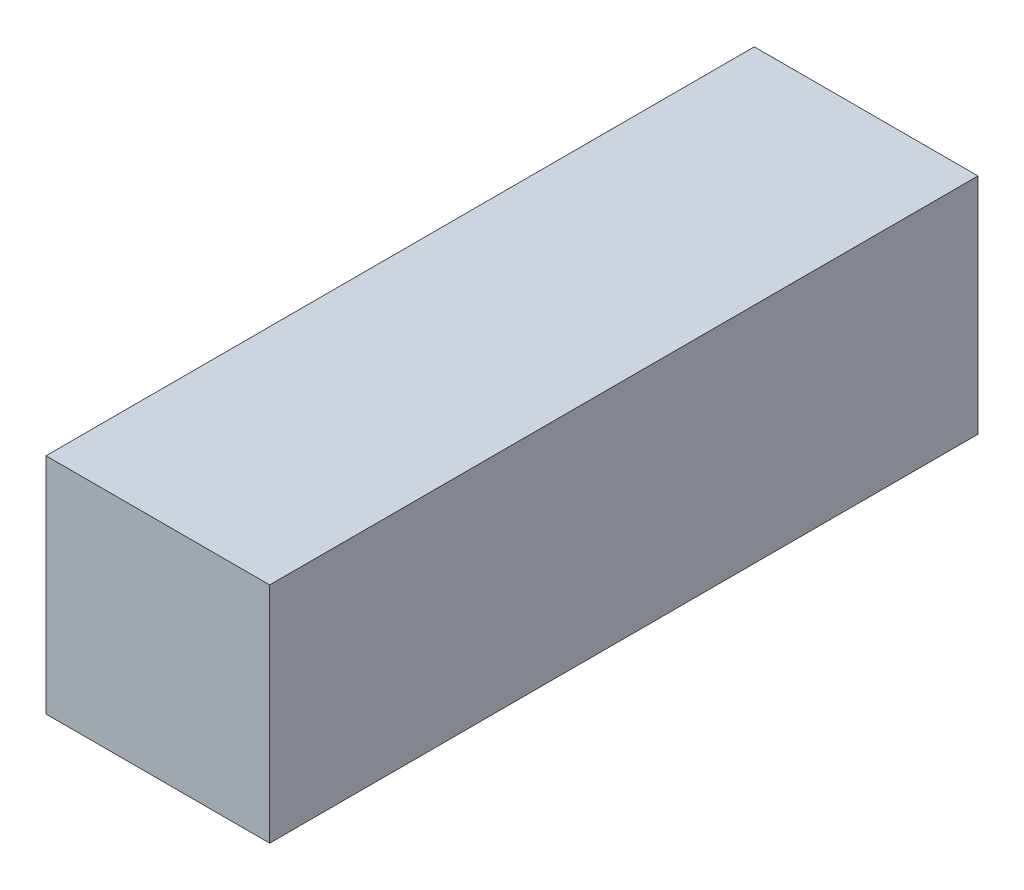
ISO-10303-21;
HEADER;
FILE_DESCRIPTION(('STEP AP214'),'2;1');
FILE_NAME('part.step','',(''),(''),'','','');
FILE_SCHEMA(('AUTOMOTIVE_DESIGN { 1 0 10303 214 1 1 1 1 }'));
ENDSEC;
DATA;
#1=APPLICATION_CONTEXT('core data for automotive mechanical design processes');
#2=APPLICATION_PROTOCOL_DEFINITION('international standard','automotive_design',2000,#1);
#3=PRODUCT_CONTEXT('',#1,'mechanical');
#4=PRODUCT('Part','Part','',(#3));
#5=PRODUCT_RELATED_PRODUCT_CATEGORY('part','',(#4));
#6=PRODUCT_DEFINITION_FORMATION('','',#4);
#7=PRODUCT_DEFINITION_CONTEXT('part definition',#1,'design');
#8=PRODUCT_DEFINITION('design','',#6,#7);
#9=PRODUCT_DEFINITION_SHAPE('','',#8);
#10=(LENGTH_UNIT() NAMED_UNIT(*) SI_UNIT(.MILLI.,.METRE.));
#11=(NAMED_UNIT(*) PLANE_ANGLE_UNIT() SI_UNIT($,.RADIAN.));
#12=(NAMED_UNIT(*) SI_UNIT($,.STERADIAN.) SOLID_ANGLE_UNIT());
#13=UNCERTAINTY_MEASURE_WITH_UNIT(LENGTH_MEASURE(1.E-05),#10,'distance_accuracy_value','');
#14=(GEOMETRIC_REPRESENTATION_CONTEXT(3) GLOBAL_UNCERTAINTY_ASSIGNED_CONTEXT((#13)) GLOBAL_UNIT_ASSIGNED_CONTEXT((#10,
#11,#12)) REPRESENTATION_CONTEXT('',''));
#15=CARTESIAN_POINT('',(0.,0.,0.));
#16=DIRECTION('',(0.,0.,1.));
#17=DIRECTION('',(1.,0.,0.));
#18=AXIS2_PLACEMENT_3D('',#15,#16,#17);
#19=CARTESIAN_POINT('',(1.5,1.5,9.5));
#20=DIRECTION('',(-1.,0.,0.));
#21=DIRECTION('',(0.,-1.,0.));
#22=AXIS2_PLACEMENT_3D('',#19,#20,#21);
#23=PLANE('',#22);
#24=DIRECTION('',(0.,1.,0.));
#25=VECTOR('',#24,1.);
#26=CARTESIAN_POINT('',(1.5,1.5,0.));
#27=LINE('',#26,#25);
#28=CARTESIAN_POINT('',(1.5,-1.5,0.));
#29=VERTEX_POINT('',#28);
#30=CARTESIAN_POINT('',(1.5,1.5,0.));
#31=VERTEX_POINT('',#30);
#32=EDGE_CURVE('E100',#29,#31,#27,.T.);
#33=ORIENTED_EDGE('',*,*,#32,.T.);
#34=DIRECTION('',(0.,0.,-1.));
#35=VECTOR('',#34,1.);
#36=CARTESIAN_POINT('',(1.5,1.5,9.5));
#37=LINE('',#36,#35);
#38=CARTESIAN_POINT('',(1.5,1.5,9.5));
#39=VERTEX_POINT('',#38);
#40=EDGE_CURVE('E11',#39,#31,#37,.T.);
#41=ORIENTED_EDGE('',*,*,#40,.F.);
#42=DIRECTION('',(0.,1.,0.));
#43=VECTOR('',#42,1.);
#44=CARTESIAN_POINT('',(1.5,1.5,9.5));
#45=LINE('',#44,#43);
#46=CARTESIAN_POINT('',(1.5,-1.5,9.5));
#47=VERTEX_POINT('',#46);
#48=EDGE_CURVE('E88',#47,#39,#45,.T.);
#49=ORIENTED_EDGE('',*,*,#48,.F.);
#50=DIRECTION('',(0.,0.,-1.));
#51=VECTOR('',#50,1.);
#52=CARTESIAN_POINT('',(1.5,-1.5,9.5));
#53=LINE('',#52,#51);
#54=EDGE_CURVE('E96',#47,#29,#53,.T.);
#55=ORIENTED_EDGE('',*,*,#54,.T.);
#56=EDGE_LOOP('',(#33,#41,#49,#55));
#57=FACE_BOUND('',#56,.T.);
#58=ADVANCED_FACE('F37',(#57),#23,.F.);
#59=CARTESIAN_POINT('',(-1.5,1.5,9.5));
#60=DIRECTION('',(0.,-1.,0.));
#61=DIRECTION('',(0.,0.,-1.));
#62=AXIS2_PLACEMENT_3D('',#59,#60,#61);
#63=PLANE('',#62);
#64=DIRECTION('',(-1.,0.,0.));
#65=VECTOR('',#64,1.);
#66=CARTESIAN_POINT('',(-1.5,1.5,0.));
#67=LINE('',#66,#65);
#68=CARTESIAN_POINT('',(-1.5,1.5,0.));
#69=VERTEX_POINT('',#68);
#70=EDGE_CURVE('E92',#31,#69,#67,.T.);
#71=ORIENTED_EDGE('',*,*,#70,.T.);
#72=DIRECTION('',(0.,0.,-1.));
#73=VECTOR('',#72,1.);
#74=CARTESIAN_POINT('',(-1.5,1.5,9.5));
#75=LINE('',#74,#73);
#76=CARTESIAN_POINT('',(-1.5,1.5,9.5));
#77=VERTEX_POINT('',#76);
#78=EDGE_CURVE('E45',#77,#69,#75,.T.);
#79=ORIENTED_EDGE('',*,*,#78,.F.);
#80=DIRECTION('',(-1.,0.,0.));
#81=VECTOR('',#80,1.);
#82=CARTESIAN_POINT('',(-1.5,1.5,9.5));
#83=LINE('',#82,#81);
#84=EDGE_CURVE('E83',#39,#77,#83,.T.);
#85=ORIENTED_EDGE('',*,*,#84,.F.);
#86=ORIENTED_EDGE('',*,*,#40,.T.);
#87=EDGE_LOOP('',(#71,#79,#85,#86));
#88=FACE_BOUND('',#87,.T.);
#89=ADVANCED_FACE('F91',(#88),#63,.F.);
#90=CARTESIAN_POINT('',(-1.5,1.5,9.5));
#91=DIRECTION('',(1.,0.,0.));
#92=DIRECTION('',(0.,0.,-1.));
#93=AXIS2_PLACEMENT_3D('',#90,#91,#92);
#94=PLANE('',#93);
#95=DIRECTION('',(0.,-1.,0.));
#96=VECTOR('',#95,1.);
#97=CARTESIAN_POINT('',(-1.5,1.5,0.));
#98=LINE('',#97,#96);
#99=CARTESIAN_POINT('',(-1.5,-1.5,0.));
#100=VERTEX_POINT('',#99);
#101=EDGE_CURVE('E70',#69,#100,#98,.T.);
#102=ORIENTED_EDGE('',*,*,#101,.T.);
#103=DIRECTION('',(0.,0.,-1.));
#104=VECTOR('',#103,1.);
#105=CARTESIAN_POINT('',(-1.5,-1.5,9.5));
#106=LINE('',#105,#104);
#107=CARTESIAN_POINT('',(-1.5,-1.5,9.5));
#108=VERTEX_POINT('',#107);
#109=EDGE_CURVE('E93',#108,#100,#106,.T.);
#110=ORIENTED_EDGE('',*,*,#109,.F.);
#111=DIRECTION('',(0.,-1.,0.));
#112=VECTOR('',#111,1.);
#113=CARTESIAN_POINT('',(-1.5,1.5,9.5));
#114=LINE('',#113,#112);
#115=EDGE_CURVE('E86',#77,#108,#114,.T.);
#116=ORIENTED_EDGE('',*,*,#115,.F.);
#117=ORIENTED_EDGE('',*,*,#78,.T.);
#118=EDGE_LOOP('',(#102,#110,#116,#117));
#119=FACE_BOUND('',#118,.T.);
#120=ADVANCED_FACE('F94',(#119),#94,.F.);
#121=CARTESIAN_POINT('',(-1.5,-1.5,9.5));
#122=DIRECTION('',(0.,1.,0.));
#123=DIRECTION('',(0.,0.,1.));
#124=AXIS2_PLACEMENT_3D('',#121,#122,#123);
#125=PLANE('',#124);
#126=DIRECTION('',(1.,0.,0.));
#127=VECTOR('',#126,1.);
#128=CARTESIAN_POINT('',(-1.5,-1.5,0.));
#129=LINE('',#128,#127);
#130=EDGE_CURVE('E76',#100,#29,#129,.T.);
#131=ORIENTED_EDGE('',*,*,#130,.T.);
#132=ORIENTED_EDGE('',*,*,#54,.F.);
#133=DIRECTION('',(1.,0.,0.));
#134=VECTOR('',#133,1.);
#135=CARTESIAN_POINT('',(-1.5,-1.5,9.5));
#136=LINE('',#135,#134);
#137=EDGE_CURVE('E53',#108,#47,#136,.T.);
#138=ORIENTED_EDGE('',*,*,#137,.F.);
#139=ORIENTED_EDGE('',*,*,#109,.T.);
#140=EDGE_LOOP('',(#131,#132,#138,#139));
#141=FACE_BOUND('',#140,.T.);
#142=ADVANCED_FACE('F107',(#141),#125,.F.);
#143=CARTESIAN_POINT('',(0.,0.,9.5));
#144=DIRECTION('',(0.,0.,1.));
#145=DIRECTION('',(1.,0.,0.));
#146=AXIS2_PLACEMENT_3D('',#143,#144,#145);
#147=PLANE('',#146);
#148=ORIENTED_EDGE('',*,*,#48,.T.);
#149=ORIENTED_EDGE('',*,*,#84,.T.);
#150=ORIENTED_EDGE('',*,*,#115,.T.);
#151=ORIENTED_EDGE('',*,*,#137,.T.);
#152=EDGE_LOOP('',(#148,#149,#150,#151));
#153=FACE_BOUND('',#152,.T.);
#154=ADVANCED_FACE('F84',(#153),#147,.T.);
#155=CARTESIAN_POINT('',(0.,0.,0.));
#156=DIRECTION('',(0.,0.,1.));
#157=DIRECTION('',(1.,0.,0.));
#158=AXIS2_PLACEMENT_3D('',#155,#156,#157);
#159=PLANE('',#158);
#160=ORIENTED_EDGE('',*,*,#32,.F.);
#161=ORIENTED_EDGE('',*,*,#130,.F.);
#162=ORIENTED_EDGE('',*,*,#101,.F.);
#163=ORIENTED_EDGE('',*,*,#70,.F.);
#164=EDGE_LOOP('',(#160,#161,#162,#163));
#165=FACE_BOUND('',#164,.T.);
#166=ADVANCED_FACE('F110',(#165),#159,.F.);
#167=CLOSED_SHELL('',(#58,#89,#120,#142,#154,#166));
#168=MANIFOLD_SOLID_BREP('B2',#167);
#169=ADVANCED_BREP_SHAPE_REPRESENTATION('',(#18,#168),#14);
#170=SHAPE_DEFINITION_REPRESENTATION(#9,#169);
ENDSEC;
END-ISO-10303-21;
